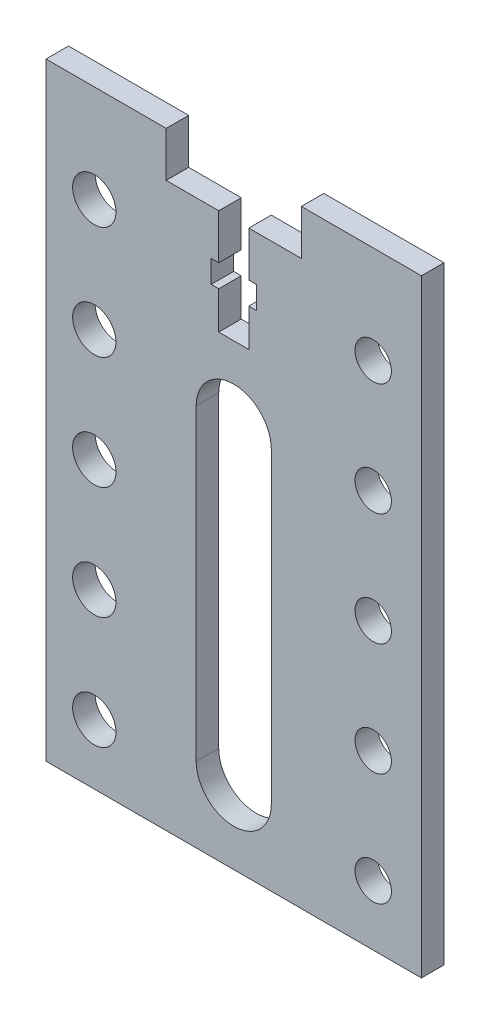
ISO-10303-21;
HEADER;
FILE_DESCRIPTION(('STEP AP214'),'2;1');
FILE_NAME('part.step','',(''),(''),'','','');
FILE_SCHEMA(('AUTOMOTIVE_DESIGN { 1 0 10303 214 1 1 1 1 }'));
ENDSEC;
DATA;
#1=APPLICATION_CONTEXT('core data for automotive mechanical design processes');
#2=APPLICATION_PROTOCOL_DEFINITION('international standard','automotive_design',2000,#1);
#3=PRODUCT_CONTEXT('',#1,'mechanical');
#4=PRODUCT('Part','Part','',(#3));
#5=PRODUCT_RELATED_PRODUCT_CATEGORY('part','',(#4));
#6=PRODUCT_DEFINITION_FORMATION('','',#4);
#7=PRODUCT_DEFINITION_CONTEXT('part definition',#1,'design');
#8=PRODUCT_DEFINITION('design','',#6,#7);
#9=PRODUCT_DEFINITION_SHAPE('','',#8);
#10=(LENGTH_UNIT() NAMED_UNIT(*) SI_UNIT(.MILLI.,.METRE.));
#11=(NAMED_UNIT(*) PLANE_ANGLE_UNIT() SI_UNIT($,.RADIAN.));
#12=(NAMED_UNIT(*) SI_UNIT($,.STERADIAN.) SOLID_ANGLE_UNIT());
#13=UNCERTAINTY_MEASURE_WITH_UNIT(LENGTH_MEASURE(1.E-05),#10,'distance_accuracy_value','');
#14=(GEOMETRIC_REPRESENTATION_CONTEXT(3) GLOBAL_UNCERTAINTY_ASSIGNED_CONTEXT((#13)) GLOBAL_UNIT_ASSIGNED_CONTEXT((#10,
#11,#12)) REPRESENTATION_CONTEXT('',''));
#15=CARTESIAN_POINT('',(0.,0.,0.));
#16=DIRECTION('',(0.,0.,1.));
#17=DIRECTION('',(1.,0.,0.));
#18=AXIS2_PLACEMENT_3D('',#15,#16,#17);
#19=CARTESIAN_POINT('',(-25.166294243022,47.6765560165975,0.));
#20=DIRECTION('',(0.,-1.,0.));
#21=DIRECTION('',(0.,0.,-1.));
#22=AXIS2_PLACEMENT_3D('',#19,#20,#21);
#23=PLANE('',#22);
#24=DIRECTION('',(1.,0.,0.));
#25=VECTOR('',#24,1.);
#26=CARTESIAN_POINT('',(-25.166294243022,47.6765560165975,3.));
#27=LINE('',#26,#25);
#28=CARTESIAN_POINT('',(-25.166294243022,47.6765560165975,3.));
#29=VERTEX_POINT('',#28);
#30=CARTESIAN_POINT('',(-18.166294243022,47.6765560165975,3.));
#31=VERTEX_POINT('',#30);
#32=EDGE_CURVE('E340',#29,#31,#27,.T.);
#33=ORIENTED_EDGE('',*,*,#32,.T.);
#34=DIRECTION('',(0.,0.,1.));
#35=VECTOR('',#34,1.);
#36=CARTESIAN_POINT('',(-18.166294243022,47.6765560165975,0.));
#37=LINE('',#36,#35);
#38=CARTESIAN_POINT('',(-18.166294243022,47.6765560165975,0.));
#39=VERTEX_POINT('',#38);
#40=EDGE_CURVE('E300',#39,#31,#37,.T.);
#41=ORIENTED_EDGE('',*,*,#40,.F.);
#42=DIRECTION('',(1.,0.,0.));
#43=VECTOR('',#42,1.);
#44=CARTESIAN_POINT('',(-25.166294243022,47.6765560165975,0.));
#45=LINE('',#44,#43);
#46=CARTESIAN_POINT('',(-25.166294243022,47.6765560165975,0.));
#47=VERTEX_POINT('',#46);
#48=EDGE_CURVE('E330',#47,#39,#45,.T.);
#49=ORIENTED_EDGE('',*,*,#48,.F.);
#50=DIRECTION('',(0.,0.,1.));
#51=VECTOR('',#50,1.);
#52=CARTESIAN_POINT('',(-25.166294243022,47.6765560165975,0.));
#53=LINE('',#52,#51);
#54=EDGE_CURVE('E336',#47,#29,#53,.T.);
#55=ORIENTED_EDGE('',*,*,#54,.T.);
#56=EDGE_LOOP('',(#33,#41,#49,#55));
#57=FACE_BOUND('',#56,.T.);
#58=ADVANCED_FACE('F33',(#57),#23,.F.);
#59=CARTESIAN_POINT('',(-41.166294243022,53.6765560165975,3.));
#60=DIRECTION('',(0.,-1.,0.));
#61=DIRECTION('',(0.,0.,-1.));
#62=AXIS2_PLACEMENT_3D('',#59,#60,#61);
#63=PLANE('',#62);
#64=DIRECTION('',(-1.,0.,0.));
#65=VECTOR('',#64,1.);
#66=CARTESIAN_POINT('',(-41.166294243022,53.6765560165975,3.));
#67=LINE('',#66,#65);
#68=CARTESIAN_POINT('',(-25.166294243022,53.6765560165975,3.));
#69=VERTEX_POINT('',#68);
#70=CARTESIAN_POINT('',(-41.166294243022,53.6765560165975,3.));
#71=VERTEX_POINT('',#70);
#72=EDGE_CURVE('E362',#69,#71,#67,.T.);
#73=ORIENTED_EDGE('',*,*,#72,.F.);
#74=DIRECTION('',(0.,0.,1.));
#75=VECTOR('',#74,1.);
#76=CARTESIAN_POINT('',(-25.166294243022,53.6765560165975,0.));
#77=LINE('',#76,#75);
#78=CARTESIAN_POINT('',(-25.166294243022,53.6765560165975,0.));
#79=VERTEX_POINT('',#78);
#80=EDGE_CURVE('E344',#79,#69,#77,.T.);
#81=ORIENTED_EDGE('',*,*,#80,.F.);
#82=DIRECTION('',(-1.,0.,0.));
#83=VECTOR('',#82,1.);
#84=CARTESIAN_POINT('',(-41.166294243022,53.6765560165975,0.));
#85=LINE('',#84,#83);
#86=CARTESIAN_POINT('',(-41.166294243022,53.6765560165975,0.));
#87=VERTEX_POINT('',#86);
#88=EDGE_CURVE('E373',#79,#87,#85,.T.);
#89=ORIENTED_EDGE('',*,*,#88,.T.);
#90=DIRECTION('',(0.,0.,-1.));
#91=VECTOR('',#90,1.);
#92=CARTESIAN_POINT('',(-41.166294243022,53.6765560165975,3.));
#93=LINE('',#92,#91);
#94=EDGE_CURVE('E366',#71,#87,#93,.T.);
#95=ORIENTED_EDGE('',*,*,#94,.F.);
#96=EDGE_LOOP('',(#73,#81,#89,#95));
#97=FACE_BOUND('',#96,.T.);
#98=ADVANCED_FACE('F408',(#97),#63,.F.);
#99=CARTESIAN_POINT('',(-41.166294243022,53.6765560165975,3.));
#100=DIRECTION('',(1.,0.,0.));
#101=DIRECTION('',(0.,0.,-1.));
#102=AXIS2_PLACEMENT_3D('',#99,#100,#101);
#103=PLANE('',#102);
#104=DIRECTION('',(0.,-1.,0.));
#105=VECTOR('',#104,1.);
#106=CARTESIAN_POINT('',(-41.166294243022,53.6765560165975,0.));
#107=LINE('',#106,#105);
#108=CARTESIAN_POINT('',(-41.166294243022,-27.3234439834025,0.));
#109=VERTEX_POINT('',#108);
#110=EDGE_CURVE('E346',#87,#109,#107,.T.);
#111=ORIENTED_EDGE('',*,*,#110,.T.);
#112=DIRECTION('',(0.,0.,-1.));
#113=VECTOR('',#112,1.);
#114=CARTESIAN_POINT('',(-41.166294243022,-27.3234439834025,3.));
#115=LINE('',#114,#113);
#116=CARTESIAN_POINT('',(-41.166294243022,-27.3234439834025,3.));
#117=VERTEX_POINT('',#116);
#118=EDGE_CURVE('E11',#117,#109,#115,.T.);
#119=ORIENTED_EDGE('',*,*,#118,.F.);
#120=DIRECTION('',(0.,-1.,0.));
#121=VECTOR('',#120,1.);
#122=CARTESIAN_POINT('',(-41.166294243022,53.6765560165975,3.));
#123=LINE('',#122,#121);
#124=EDGE_CURVE('E354',#71,#117,#123,.T.);
#125=ORIENTED_EDGE('',*,*,#124,.F.);
#126=ORIENTED_EDGE('',*,*,#94,.T.);
#127=EDGE_LOOP('',(#111,#119,#125,#126));
#128=FACE_BOUND('',#127,.T.);
#129=ADVANCED_FACE('F35',(#128),#103,.F.);
#130=CARTESIAN_POINT('',(-41.166294243022,-27.3234439834025,3.));
#131=DIRECTION('',(0.,1.,0.));
#132=DIRECTION('',(0.,0.,1.));
#133=AXIS2_PLACEMENT_3D('',#130,#131,#132);
#134=PLANE('',#133);
#135=DIRECTION('',(1.,0.,0.));
#136=VECTOR('',#135,1.);
#137=CARTESIAN_POINT('',(-41.166294243022,-27.3234439834025,0.));
#138=LINE('',#137,#136);
#139=CARTESIAN_POINT('',(8.83370575697797,-27.3234439834025,0.));
#140=VERTEX_POINT('',#139);
#141=EDGE_CURVE('E369',#109,#140,#138,.T.);
#142=ORIENTED_EDGE('',*,*,#141,.T.);
#143=DIRECTION('',(0.,0.,-1.));
#144=VECTOR('',#143,1.);
#145=CARTESIAN_POINT('',(8.83370575697797,-27.3234439834025,3.));
#146=LINE('',#145,#144);
#147=CARTESIAN_POINT('',(8.83370575697797,-27.3234439834025,3.));
#148=VERTEX_POINT('',#147);
#149=EDGE_CURVE('E41',#148,#140,#146,.T.);
#150=ORIENTED_EDGE('',*,*,#149,.F.);
#151=DIRECTION('',(1.,0.,0.));
#152=VECTOR('',#151,1.);
#153=CARTESIAN_POINT('',(-41.166294243022,-27.3234439834025,3.));
#154=LINE('',#153,#152);
#155=EDGE_CURVE('E357',#117,#148,#154,.T.);
#156=ORIENTED_EDGE('',*,*,#155,.F.);
#157=ORIENTED_EDGE('',*,*,#118,.T.);
#158=EDGE_LOOP('',(#142,#150,#156,#157));
#159=FACE_BOUND('',#158,.T.);
#160=ADVANCED_FACE('F401',(#159),#134,.F.);
#161=CARTESIAN_POINT('',(8.83370575697796,53.6765560165975,3.));
#162=DIRECTION('',(-1.,0.,0.));
#163=DIRECTION('',(0.,-1.,0.));
#164=AXIS2_PLACEMENT_3D('',#161,#162,#163);
#165=PLANE('',#164);
#166=DIRECTION('',(0.,1.,0.));
#167=VECTOR('',#166,1.);
#168=CARTESIAN_POINT('',(8.83370575697796,53.6765560165975,0.));
#169=LINE('',#168,#167);
#170=CARTESIAN_POINT('',(8.83370575697796,53.6765560165975,0.));
#171=VERTEX_POINT('',#170);
#172=EDGE_CURVE('E371',#140,#171,#169,.T.);
#173=ORIENTED_EDGE('',*,*,#172,.T.);
#174=DIRECTION('',(0.,0.,-1.));
#175=VECTOR('',#174,1.);
#176=CARTESIAN_POINT('',(8.83370575697796,53.6765560165975,3.));
#177=LINE('',#176,#175);
#178=CARTESIAN_POINT('',(8.83370575697796,53.6765560165975,3.));
#179=VERTEX_POINT('',#178);
#180=EDGE_CURVE('E378',#179,#171,#177,.T.);
#181=ORIENTED_EDGE('',*,*,#180,.F.);
#182=DIRECTION('',(0.,1.,0.));
#183=VECTOR('',#182,1.);
#184=CARTESIAN_POINT('',(8.83370575697796,53.6765560165975,3.));
#185=LINE('',#184,#183);
#186=EDGE_CURVE('E360',#148,#179,#185,.T.);
#187=ORIENTED_EDGE('',*,*,#186,.F.);
#188=ORIENTED_EDGE('',*,*,#149,.T.);
#189=EDGE_LOOP('',(#173,#181,#187,#188));
#190=FACE_BOUND('',#189,.T.);
#191=ADVANCED_FACE('F385',(#190),#165,.F.);
#192=CARTESIAN_POINT('',(-7.16629424302204,53.6765560165975,0.));
#193=VERTEX_POINT('',#192);
#194=EDGE_CURVE('E358',#171,#193,#85,.T.);
#195=ORIENTED_EDGE('',*,*,#194,.T.);
#196=DIRECTION('',(0.,0.,1.));
#197=VECTOR('',#196,1.);
#198=CARTESIAN_POINT('',(-7.16629424302204,53.6765560165975,0.));
#199=LINE('',#198,#197);
#200=CARTESIAN_POINT('',(-7.16629424302204,53.6765560165975,3.));
#201=VERTEX_POINT('',#200);
#202=EDGE_CURVE('E347',#193,#201,#199,.T.);
#203=ORIENTED_EDGE('',*,*,#202,.T.);
#204=EDGE_CURVE('E363',#179,#201,#67,.T.);
#205=ORIENTED_EDGE('',*,*,#204,.F.);
#206=ORIENTED_EDGE('',*,*,#180,.T.);
#207=EDGE_LOOP('',(#195,#203,#205,#206));
#208=FACE_BOUND('',#207,.T.);
#209=ADVANCED_FACE('F392',(#208),#63,.F.);
#210=CARTESIAN_POINT('',(0.,0.,3.));
#211=DIRECTION('',(0.,0.,1.));
#212=DIRECTION('',(1.,0.,0.));
#213=AXIS2_PLACEMENT_3D('',#210,#211,#212);
#214=PLANE('',#213);
#215=CARTESIAN_POINT('',(2.40870575697796,40.6765560165975,3.));
#216=DIRECTION('',(0.,0.,1.));
#217=DIRECTION('',(1.,0.,0.));
#218=AXIS2_PLACEMENT_3D('',#215,#216,#217);
#219=CIRCLE('',#218,2.42322983462693);
#220=CARTESIAN_POINT('',(4.83193559160489,40.6765560165975,3.));
#221=VERTEX_POINT('',#220);
#222=EDGE_CURVE('E770',#221,#221,#219,.T.);
#223=ORIENTED_EDGE('',*,*,#222,.F.);
#224=EDGE_LOOP('',(#223));
#225=FACE_BOUND('',#224,.T.);
#226=CARTESIAN_POINT('',(-34.741294243022,40.6765560165975,3.));
#227=DIRECTION('',(0.,0.,1.));
#228=DIRECTION('',(1.,0.,0.));
#229=AXIS2_PLACEMENT_3D('',#226,#227,#228);
#230=CIRCLE('',#229,2.88561072581813);
#231=CARTESIAN_POINT('',(-31.8556835172039,40.6765560165975,3.));
#232=VERTEX_POINT('',#231);
#233=EDGE_CURVE('E772',#232,#232,#230,.T.);
#234=ORIENTED_EDGE('',*,*,#233,.F.);
#235=EDGE_LOOP('',(#234));
#236=FACE_BOUND('',#235,.T.);
#237=CARTESIAN_POINT('',(2.40870575697796,25.6765560165975,3.));
#238=DIRECTION('',(0.,0.,1.));
#239=DIRECTION('',(1.,0.,0.));
#240=AXIS2_PLACEMENT_3D('',#237,#238,#239);
#241=CIRCLE('',#240,2.42322983462693);
#242=CARTESIAN_POINT('',(4.8319355916049,25.6765560165975,3.));
#243=VERTEX_POINT('',#242);
#244=EDGE_CURVE('E778',#243,#243,#241,.T.);
#245=ORIENTED_EDGE('',*,*,#244,.F.);
#246=EDGE_LOOP('',(#245));
#247=FACE_BOUND('',#246,.T.);
#248=CARTESIAN_POINT('',(-34.741294243022,25.6765560165975,3.));
#249=DIRECTION('',(0.,0.,1.));
#250=DIRECTION('',(1.,0.,0.));
#251=AXIS2_PLACEMENT_3D('',#248,#249,#250);
#252=CIRCLE('',#251,2.88561072581813);
#253=CARTESIAN_POINT('',(-31.8556835172039,25.6765560165975,3.));
#254=VERTEX_POINT('',#253);
#255=EDGE_CURVE('E784',#254,#254,#252,.T.);
#256=ORIENTED_EDGE('',*,*,#255,.F.);
#257=EDGE_LOOP('',(#256));
#258=FACE_BOUND('',#257,.T.);
#259=CARTESIAN_POINT('',(2.40870575697796,10.6765560165975,3.));
#260=DIRECTION('',(0.,0.,1.));
#261=DIRECTION('',(1.,0.,0.));
#262=AXIS2_PLACEMENT_3D('',#259,#260,#261);
#263=CIRCLE('',#262,2.42322983462693);
#264=CARTESIAN_POINT('',(4.8319355916049,10.6765560165975,3.));
#265=VERTEX_POINT('',#264);
#266=EDGE_CURVE('E790',#265,#265,#263,.T.);
#267=ORIENTED_EDGE('',*,*,#266,.F.);
#268=EDGE_LOOP('',(#267));
#269=FACE_BOUND('',#268,.T.);
#270=CARTESIAN_POINT('',(-34.741294243022,10.6765560165975,3.));
#271=DIRECTION('',(0.,0.,1.));
#272=DIRECTION('',(1.,0.,0.));
#273=AXIS2_PLACEMENT_3D('',#270,#271,#272);
#274=CIRCLE('',#273,2.88561072581813);
#275=CARTESIAN_POINT('',(-31.8556835172039,10.6765560165975,3.));
#276=VERTEX_POINT('',#275);
#277=EDGE_CURVE('E796',#276,#276,#274,.T.);
#278=ORIENTED_EDGE('',*,*,#277,.F.);
#279=EDGE_LOOP('',(#278));
#280=FACE_BOUND('',#279,.T.);
#281=CARTESIAN_POINT('',(2.40870575697796,-4.3234439834025,3.));
#282=DIRECTION('',(0.,0.,1.));
#283=DIRECTION('',(1.,0.,0.));
#284=AXIS2_PLACEMENT_3D('',#281,#282,#283);
#285=CIRCLE('',#284,2.42322983462693);
#286=CARTESIAN_POINT('',(4.8319355916049,-4.3234439834025,3.));
#287=VERTEX_POINT('',#286);
#288=EDGE_CURVE('E802',#287,#287,#285,.T.);
#289=ORIENTED_EDGE('',*,*,#288,.F.);
#290=EDGE_LOOP('',(#289));
#291=FACE_BOUND('',#290,.T.);
#292=CARTESIAN_POINT('',(-34.741294243022,-4.3234439834025,3.));
#293=DIRECTION('',(0.,0.,1.));
#294=DIRECTION('',(1.,0.,0.));
#295=AXIS2_PLACEMENT_3D('',#292,#293,#294);
#296=CIRCLE('',#295,2.88561072581813);
#297=CARTESIAN_POINT('',(-31.8556835172039,-4.3234439834025,3.));
#298=VERTEX_POINT('',#297);
#299=EDGE_CURVE('E808',#298,#298,#296,.T.);
#300=ORIENTED_EDGE('',*,*,#299,.F.);
#301=EDGE_LOOP('',(#300));
#302=FACE_BOUND('',#301,.T.);
#303=CARTESIAN_POINT('',(2.40870575697796,-19.3234439834025,3.));
#304=DIRECTION('',(0.,0.,1.));
#305=DIRECTION('',(1.,0.,0.));
#306=AXIS2_PLACEMENT_3D('',#303,#304,#305);
#307=CIRCLE('',#306,2.42322983462693);
#308=CARTESIAN_POINT('',(4.8319355916049,-19.3234439834025,3.));
#309=VERTEX_POINT('',#308);
#310=EDGE_CURVE('E814',#309,#309,#307,.T.);
#311=ORIENTED_EDGE('',*,*,#310,.F.);
#312=EDGE_LOOP('',(#311));
#313=FACE_BOUND('',#312,.T.);
#314=CARTESIAN_POINT('',(-34.741294243022,-19.3234439834025,3.));
#315=DIRECTION('',(0.,0.,1.));
#316=DIRECTION('',(1.,0.,0.));
#317=AXIS2_PLACEMENT_3D('',#314,#315,#316);
#318=CIRCLE('',#317,2.88561072581813);
#319=CARTESIAN_POINT('',(-31.8556835172039,-19.3234439834025,3.));
#320=VERTEX_POINT('',#319);
#321=EDGE_CURVE('E218',#320,#320,#318,.T.);
#322=ORIENTED_EDGE('',*,*,#321,.F.);
#323=EDGE_LOOP('',(#322));
#324=FACE_BOUND('',#323,.T.);
#325=CARTESIAN_POINT('',(-16.166294243022,23.6765560165975,3.));
#326=DIRECTION('',(0.,0.,1.));
#327=DIRECTION('',(1.,0.,0.));
#328=AXIS2_PLACEMENT_3D('',#325,#326,#327);
#329=CIRCLE('',#328,5.);
#330=CARTESIAN_POINT('',(-11.166294243022,23.6765560165975,3.));
#331=VERTEX_POINT('',#330);
#332=CARTESIAN_POINT('',(-21.166294243022,23.6765560165975,3.));
#333=VERTEX_POINT('',#332);
#334=EDGE_CURVE('E48',#331,#333,#329,.T.);
#335=ORIENTED_EDGE('',*,*,#334,.F.);
#336=DIRECTION('',(0.,1.,0.));
#337=VECTOR('',#336,1.);
#338=CARTESIAN_POINT('',(-11.166294243022,23.6765560165975,3.));
#339=LINE('',#338,#337);
#340=CARTESIAN_POINT('',(-11.166294243022,-17.3234439834025,3.));
#341=VERTEX_POINT('',#340);
#342=EDGE_CURVE('E212',#341,#331,#339,.T.);
#343=ORIENTED_EDGE('',*,*,#342,.F.);
#344=CARTESIAN_POINT('',(-16.166294243022,-17.3234439834025,3.));
#345=DIRECTION('',(0.,0.,1.));
#346=DIRECTION('',(1.,0.,0.));
#347=AXIS2_PLACEMENT_3D('',#344,#345,#346);
#348=CIRCLE('',#347,5.);
#349=CARTESIAN_POINT('',(-21.166294243022,-17.3234439834025,3.));
#350=VERTEX_POINT('',#349);
#351=EDGE_CURVE('E215',#350,#341,#348,.T.);
#352=ORIENTED_EDGE('',*,*,#351,.F.);
#353=DIRECTION('',(0.,-1.,0.));
#354=VECTOR('',#353,1.);
#355=CARTESIAN_POINT('',(-21.166294243022,23.6765560165975,3.));
#356=LINE('',#355,#354);
#357=EDGE_CURVE('E224',#333,#350,#356,.T.);
#358=ORIENTED_EDGE('',*,*,#357,.F.);
#359=EDGE_LOOP('',(#335,#343,#352,#358));
#360=FACE_BOUND('',#359,.T.);
#361=DIRECTION('',(0.,-1.,0.));
#362=VECTOR('',#361,1.);
#363=CARTESIAN_POINT('',(-18.166294243022,47.6765560165975,3.));
#364=LINE('',#363,#362);
#365=CARTESIAN_POINT('',(-18.166294243022,41.6765560165975,3.));
#366=VERTEX_POINT('',#365);
#367=EDGE_CURVE('E231',#31,#366,#364,.T.);
#368=ORIENTED_EDGE('',*,*,#367,.F.);
#369=ORIENTED_EDGE('',*,*,#32,.F.);
#370=DIRECTION('',(0.,-1.,0.));
#371=VECTOR('',#370,1.);
#372=CARTESIAN_POINT('',(-25.166294243022,53.6765560165975,3.));
#373=LINE('',#372,#371);
#374=EDGE_CURVE('E302',#69,#29,#373,.T.);
#375=ORIENTED_EDGE('',*,*,#374,.F.);
#376=ORIENTED_EDGE('',*,*,#72,.T.);
#377=ORIENTED_EDGE('',*,*,#124,.T.);
#378=ORIENTED_EDGE('',*,*,#155,.T.);
#379=ORIENTED_EDGE('',*,*,#186,.T.);
#380=ORIENTED_EDGE('',*,*,#204,.T.);
#381=DIRECTION('',(0.,1.,0.));
#382=VECTOR('',#381,1.);
#383=CARTESIAN_POINT('',(-7.16629424302204,53.6765560165975,3.));
#384=LINE('',#383,#382);
#385=CARTESIAN_POINT('',(-7.16629424302204,47.6765560165975,3.));
#386=VERTEX_POINT('',#385);
#387=EDGE_CURVE('E329',#386,#201,#384,.T.);
#388=ORIENTED_EDGE('',*,*,#387,.F.);
#389=CARTESIAN_POINT('',(-14.166294243022,47.6765560165975,3.));
#390=VERTEX_POINT('',#389);
#391=EDGE_CURVE('E339',#390,#386,#27,.T.);
#392=ORIENTED_EDGE('',*,*,#391,.F.);
#393=DIRECTION('',(0.,1.,0.));
#394=VECTOR('',#393,1.);
#395=CARTESIAN_POINT('',(-14.166294243022,47.6765560165975,3.));
#396=LINE('',#395,#394);
#397=CARTESIAN_POINT('',(-14.166294243022,41.6765560165975,3.));
#398=VERTEX_POINT('',#397);
#399=EDGE_CURVE('E239',#398,#390,#396,.T.);
#400=ORIENTED_EDGE('',*,*,#399,.F.);
#401=DIRECTION('',(-1.,0.,0.));
#402=VECTOR('',#401,1.);
#403=CARTESIAN_POINT('',(-13.166294243022,41.6765560165975,3.));
#404=LINE('',#403,#402);
#405=CARTESIAN_POINT('',(-13.166294243022,41.6765560165975,3.));
#406=VERTEX_POINT('',#405);
#407=EDGE_CURVE('E296',#406,#398,#404,.T.);
#408=ORIENTED_EDGE('',*,*,#407,.F.);
#409=DIRECTION('',(0.,1.,0.));
#410=VECTOR('',#409,1.);
#411=CARTESIAN_POINT('',(-13.166294243022,41.6765560165975,3.));
#412=LINE('',#411,#410);
#413=CARTESIAN_POINT('',(-13.166294243022,38.6765560165975,3.));
#414=VERTEX_POINT('',#413);
#415=EDGE_CURVE('E293',#414,#406,#412,.T.);
#416=ORIENTED_EDGE('',*,*,#415,.F.);
#417=DIRECTION('',(1.,0.,0.));
#418=VECTOR('',#417,1.);
#419=CARTESIAN_POINT('',(-13.166294243022,38.6765560165975,3.));
#420=LINE('',#419,#418);
#421=CARTESIAN_POINT('',(-14.166294243022,38.6765560165975,3.));
#422=VERTEX_POINT('',#421);
#423=EDGE_CURVE('E290',#422,#414,#420,.T.);
#424=ORIENTED_EDGE('',*,*,#423,.F.);
#425=DIRECTION('',(0.,1.,0.));
#426=VECTOR('',#425,1.);
#427=CARTESIAN_POINT('',(-14.166294243022,38.6765560165975,3.));
#428=LINE('',#427,#426);
#429=CARTESIAN_POINT('',(-14.166294243022,33.6765560165975,3.));
#430=VERTEX_POINT('',#429);
#431=EDGE_CURVE('E287',#430,#422,#428,.T.);
#432=ORIENTED_EDGE('',*,*,#431,.F.);
#433=DIRECTION('',(1.,0.,0.));
#434=VECTOR('',#433,1.);
#435=CARTESIAN_POINT('',(-18.166294243022,33.6765560165975,3.));
#436=LINE('',#435,#434);
#437=CARTESIAN_POINT('',(-18.166294243022,33.6765560165975,3.));
#438=VERTEX_POINT('',#437);
#439=EDGE_CURVE('E284',#438,#430,#436,.T.);
#440=ORIENTED_EDGE('',*,*,#439,.F.);
#441=DIRECTION('',(0.,-1.,0.));
#442=VECTOR('',#441,1.);
#443=CARTESIAN_POINT('',(-18.166294243022,38.6765560165975,3.));
#444=LINE('',#443,#442);
#445=CARTESIAN_POINT('',(-18.166294243022,38.6765560165975,3.));
#446=VERTEX_POINT('',#445);
#447=EDGE_CURVE('E281',#446,#438,#444,.T.);
#448=ORIENTED_EDGE('',*,*,#447,.F.);
#449=DIRECTION('',(1.,0.,0.));
#450=VECTOR('',#449,1.);
#451=CARTESIAN_POINT('',(-18.166294243022,38.6765560165975,3.));
#452=LINE('',#451,#450);
#453=CARTESIAN_POINT('',(-19.166294243022,38.6765560165975,3.));
#454=VERTEX_POINT('',#453);
#455=EDGE_CURVE('E278',#454,#446,#452,.T.);
#456=ORIENTED_EDGE('',*,*,#455,.F.);
#457=DIRECTION('',(0.,-1.,0.));
#458=VECTOR('',#457,1.);
#459=CARTESIAN_POINT('',(-19.166294243022,41.6765560165975,3.));
#460=LINE('',#459,#458);
#461=CARTESIAN_POINT('',(-19.166294243022,41.6765560165975,3.));
#462=VERTEX_POINT('',#461);
#463=EDGE_CURVE('E275',#462,#454,#460,.T.);
#464=ORIENTED_EDGE('',*,*,#463,.F.);
#465=DIRECTION('',(-1.,0.,0.));
#466=VECTOR('',#465,1.);
#467=CARTESIAN_POINT('',(-18.166294243022,41.6765560165975,3.));
#468=LINE('',#467,#466);
#469=EDGE_CURVE('E272',#366,#462,#468,.T.);
#470=ORIENTED_EDGE('',*,*,#469,.F.);
#471=EDGE_LOOP('',(#368,#369,#375,#376,#377,#378,#379,#380,#388,#392,#400,#408,#416,#424,#432,
#440,#448,#456,#464,#470));
#472=FACE_BOUND('',#471,.T.);
#473=ADVANCED_FACE('F397',(#225,#236,#247,#258,#269,#280,#291,#302,#313,#324,#360,#472),#214,.T.);
#474=CARTESIAN_POINT('',(0.,0.,0.));
#475=DIRECTION('',(0.,0.,1.));
#476=DIRECTION('',(1.,0.,0.));
#477=AXIS2_PLACEMENT_3D('',#474,#475,#476);
#478=PLANE('',#477);
#479=CARTESIAN_POINT('',(2.40870575697796,40.6765560165975,0.));
#480=DIRECTION('',(0.,0.,1.));
#481=DIRECTION('',(1.,0.,0.));
#482=AXIS2_PLACEMENT_3D('',#479,#480,#481);
#483=CIRCLE('',#482,2.42322983462693);
#484=CARTESIAN_POINT('',(4.83193559160489,40.6765560165975,0.));
#485=VERTEX_POINT('',#484);
#486=EDGE_CURVE('E767',#485,#485,#483,.T.);
#487=ORIENTED_EDGE('',*,*,#486,.T.);
#488=EDGE_LOOP('',(#487));
#489=FACE_BOUND('',#488,.T.);
#490=CARTESIAN_POINT('',(-34.741294243022,40.6765560165975,0.));
#491=DIRECTION('',(0.,0.,1.));
#492=DIRECTION('',(1.,0.,0.));
#493=AXIS2_PLACEMENT_3D('',#490,#491,#492);
#494=CIRCLE('',#493,2.88561072581813);
#495=CARTESIAN_POINT('',(-31.8556835172039,40.6765560165975,0.));
#496=VERTEX_POINT('',#495);
#497=EDGE_CURVE('E775',#496,#496,#494,.T.);
#498=ORIENTED_EDGE('',*,*,#497,.T.);
#499=EDGE_LOOP('',(#498));
#500=FACE_BOUND('',#499,.T.);
#501=CARTESIAN_POINT('',(2.40870575697796,25.6765560165975,0.));
#502=DIRECTION('',(0.,0.,1.));
#503=DIRECTION('',(1.,0.,0.));
#504=AXIS2_PLACEMENT_3D('',#501,#502,#503);
#505=CIRCLE('',#504,2.42322983462693);
#506=CARTESIAN_POINT('',(4.8319355916049,25.6765560165975,0.));
#507=VERTEX_POINT('',#506);
#508=EDGE_CURVE('E781',#507,#507,#505,.T.);
#509=ORIENTED_EDGE('',*,*,#508,.T.);
#510=EDGE_LOOP('',(#509));
#511=FACE_BOUND('',#510,.T.);
#512=CARTESIAN_POINT('',(-34.741294243022,25.6765560165975,0.));
#513=DIRECTION('',(0.,0.,1.));
#514=DIRECTION('',(1.,0.,0.));
#515=AXIS2_PLACEMENT_3D('',#512,#513,#514);
#516=CIRCLE('',#515,2.88561072581813);
#517=CARTESIAN_POINT('',(-31.8556835172039,25.6765560165975,0.));
#518=VERTEX_POINT('',#517);
#519=EDGE_CURVE('E787',#518,#518,#516,.T.);
#520=ORIENTED_EDGE('',*,*,#519,.T.);
#521=EDGE_LOOP('',(#520));
#522=FACE_BOUND('',#521,.T.);
#523=CARTESIAN_POINT('',(2.40870575697796,10.6765560165975,0.));
#524=DIRECTION('',(0.,0.,1.));
#525=DIRECTION('',(1.,0.,0.));
#526=AXIS2_PLACEMENT_3D('',#523,#524,#525);
#527=CIRCLE('',#526,2.42322983462693);
#528=CARTESIAN_POINT('',(4.8319355916049,10.6765560165975,0.));
#529=VERTEX_POINT('',#528);
#530=EDGE_CURVE('E793',#529,#529,#527,.T.);
#531=ORIENTED_EDGE('',*,*,#530,.T.);
#532=EDGE_LOOP('',(#531));
#533=FACE_BOUND('',#532,.T.);
#534=CARTESIAN_POINT('',(-34.741294243022,10.6765560165975,0.));
#535=DIRECTION('',(0.,0.,1.));
#536=DIRECTION('',(1.,0.,0.));
#537=AXIS2_PLACEMENT_3D('',#534,#535,#536);
#538=CIRCLE('',#537,2.88561072581813);
#539=CARTESIAN_POINT('',(-31.8556835172039,10.6765560165975,0.));
#540=VERTEX_POINT('',#539);
#541=EDGE_CURVE('E799',#540,#540,#538,.T.);
#542=ORIENTED_EDGE('',*,*,#541,.T.);
#543=EDGE_LOOP('',(#542));
#544=FACE_BOUND('',#543,.T.);
#545=CARTESIAN_POINT('',(2.40870575697796,-4.3234439834025,0.));
#546=DIRECTION('',(0.,0.,1.));
#547=DIRECTION('',(1.,0.,0.));
#548=AXIS2_PLACEMENT_3D('',#545,#546,#547);
#549=CIRCLE('',#548,2.42322983462693);
#550=CARTESIAN_POINT('',(4.8319355916049,-4.3234439834025,0.));
#551=VERTEX_POINT('',#550);
#552=EDGE_CURVE('E805',#551,#551,#549,.T.);
#553=ORIENTED_EDGE('',*,*,#552,.T.);
#554=EDGE_LOOP('',(#553));
#555=FACE_BOUND('',#554,.T.);
#556=CARTESIAN_POINT('',(-34.741294243022,-4.3234439834025,0.));
#557=DIRECTION('',(0.,0.,1.));
#558=DIRECTION('',(1.,0.,0.));
#559=AXIS2_PLACEMENT_3D('',#556,#557,#558);
#560=CIRCLE('',#559,2.88561072581813);
#561=CARTESIAN_POINT('',(-31.8556835172039,-4.3234439834025,0.));
#562=VERTEX_POINT('',#561);
#563=EDGE_CURVE('E811',#562,#562,#560,.T.);
#564=ORIENTED_EDGE('',*,*,#563,.T.);
#565=EDGE_LOOP('',(#564));
#566=FACE_BOUND('',#565,.T.);
#567=CARTESIAN_POINT('',(2.40870575697796,-19.3234439834025,0.));
#568=DIRECTION('',(0.,0.,1.));
#569=DIRECTION('',(1.,0.,0.));
#570=AXIS2_PLACEMENT_3D('',#567,#568,#569);
#571=CIRCLE('',#570,2.42322983462693);
#572=CARTESIAN_POINT('',(4.8319355916049,-19.3234439834025,0.));
#573=VERTEX_POINT('',#572);
#574=EDGE_CURVE('E817',#573,#573,#571,.T.);
#575=ORIENTED_EDGE('',*,*,#574,.T.);
#576=EDGE_LOOP('',(#575));
#577=FACE_BOUND('',#576,.T.);
#578=CARTESIAN_POINT('',(-34.741294243022,-19.3234439834025,0.));
#579=DIRECTION('',(0.,0.,1.));
#580=DIRECTION('',(1.,0.,0.));
#581=AXIS2_PLACEMENT_3D('',#578,#579,#580);
#582=CIRCLE('',#581,2.88561072581813);
#583=CARTESIAN_POINT('',(-31.8556835172039,-19.3234439834025,0.));
#584=VERTEX_POINT('',#583);
#585=EDGE_CURVE('E225',#584,#584,#582,.T.);
#586=ORIENTED_EDGE('',*,*,#585,.T.);
#587=EDGE_LOOP('',(#586));
#588=FACE_BOUND('',#587,.T.);
#589=DIRECTION('',(0.,1.,0.));
#590=VECTOR('',#589,1.);
#591=CARTESIAN_POINT('',(-11.166294243022,23.6765560165975,0.));
#592=LINE('',#591,#590);
#593=CARTESIAN_POINT('',(-11.166294243022,-17.3234439834025,0.));
#594=VERTEX_POINT('',#593);
#595=CARTESIAN_POINT('',(-11.166294243022,23.6765560165975,0.));
#596=VERTEX_POINT('',#595);
#597=EDGE_CURVE('E202',#594,#596,#592,.T.);
#598=ORIENTED_EDGE('',*,*,#597,.T.);
#599=CARTESIAN_POINT('',(-16.166294243022,23.6765560165975,0.));
#600=DIRECTION('',(0.,0.,1.));
#601=DIRECTION('',(1.,0.,0.));
#602=AXIS2_PLACEMENT_3D('',#599,#600,#601);
#603=CIRCLE('',#602,5.);
#604=CARTESIAN_POINT('',(-21.166294243022,23.6765560165975,0.));
#605=VERTEX_POINT('',#604);
#606=EDGE_CURVE('E196',#596,#605,#603,.T.);
#607=ORIENTED_EDGE('',*,*,#606,.T.);
#608=DIRECTION('',(0.,-1.,0.));
#609=VECTOR('',#608,1.);
#610=CARTESIAN_POINT('',(-21.166294243022,23.6765560165975,0.));
#611=LINE('',#610,#609);
#612=CARTESIAN_POINT('',(-21.166294243022,-17.3234439834025,0.));
#613=VERTEX_POINT('',#612);
#614=EDGE_CURVE('E205',#605,#613,#611,.T.);
#615=ORIENTED_EDGE('',*,*,#614,.T.);
#616=CARTESIAN_POINT('',(-16.166294243022,-17.3234439834025,0.));
#617=DIRECTION('',(0.,0.,1.));
#618=DIRECTION('',(1.,0.,0.));
#619=AXIS2_PLACEMENT_3D('',#616,#617,#618);
#620=CIRCLE('',#619,5.);
#621=EDGE_CURVE('E56',#613,#594,#620,.T.);
#622=ORIENTED_EDGE('',*,*,#621,.T.);
#623=EDGE_LOOP('',(#598,#607,#615,#622));
#624=FACE_BOUND('',#623,.T.);
#625=ORIENTED_EDGE('',*,*,#48,.T.);
#626=DIRECTION('',(0.,-1.,0.));
#627=VECTOR('',#626,1.);
#628=CARTESIAN_POINT('',(-18.166294243022,47.6765560165975,0.));
#629=LINE('',#628,#627);
#630=CARTESIAN_POINT('',(-18.166294243022,41.6765560165975,0.));
#631=VERTEX_POINT('',#630);
#632=EDGE_CURVE('E235',#39,#631,#629,.T.);
#633=ORIENTED_EDGE('',*,*,#632,.T.);
#634=DIRECTION('',(-1.,0.,0.));
#635=VECTOR('',#634,1.);
#636=CARTESIAN_POINT('',(-18.166294243022,41.6765560165975,0.));
#637=LINE('',#636,#635);
#638=CARTESIAN_POINT('',(-19.166294243022,41.6765560165975,0.));
#639=VERTEX_POINT('',#638);
#640=EDGE_CURVE('E238',#631,#639,#637,.T.);
#641=ORIENTED_EDGE('',*,*,#640,.T.);
#642=DIRECTION('',(0.,-1.,0.));
#643=VECTOR('',#642,1.);
#644=CARTESIAN_POINT('',(-19.166294243022,41.6765560165975,0.));
#645=LINE('',#644,#643);
#646=CARTESIAN_POINT('',(-19.166294243022,38.6765560165975,0.));
#647=VERTEX_POINT('',#646);
#648=EDGE_CURVE('E242',#639,#647,#645,.T.);
#649=ORIENTED_EDGE('',*,*,#648,.T.);
#650=DIRECTION('',(1.,0.,0.));
#651=VECTOR('',#650,1.);
#652=CARTESIAN_POINT('',(-18.166294243022,38.6765560165975,0.));
#653=LINE('',#652,#651);
#654=CARTESIAN_POINT('',(-18.166294243022,38.6765560165975,0.));
#655=VERTEX_POINT('',#654);
#656=EDGE_CURVE('E245',#647,#655,#653,.T.);
#657=ORIENTED_EDGE('',*,*,#656,.T.);
#658=DIRECTION('',(0.,-1.,0.));
#659=VECTOR('',#658,1.);
#660=CARTESIAN_POINT('',(-18.166294243022,38.6765560165975,0.));
#661=LINE('',#660,#659);
#662=CARTESIAN_POINT('',(-18.166294243022,33.6765560165975,0.));
#663=VERTEX_POINT('',#662);
#664=EDGE_CURVE('E248',#655,#663,#661,.T.);
#665=ORIENTED_EDGE('',*,*,#664,.T.);
#666=DIRECTION('',(1.,0.,0.));
#667=VECTOR('',#666,1.);
#668=CARTESIAN_POINT('',(-18.166294243022,33.6765560165975,0.));
#669=LINE('',#668,#667);
#670=CARTESIAN_POINT('',(-14.166294243022,33.6765560165975,0.));
#671=VERTEX_POINT('',#670);
#672=EDGE_CURVE('E251',#663,#671,#669,.T.);
#673=ORIENTED_EDGE('',*,*,#672,.T.);
#674=DIRECTION('',(0.,1.,0.));
#675=VECTOR('',#674,1.);
#676=CARTESIAN_POINT('',(-14.166294243022,38.6765560165975,0.));
#677=LINE('',#676,#675);
#678=CARTESIAN_POINT('',(-14.166294243022,38.6765560165975,0.));
#679=VERTEX_POINT('',#678);
#680=EDGE_CURVE('E254',#671,#679,#677,.T.);
#681=ORIENTED_EDGE('',*,*,#680,.T.);
#682=DIRECTION('',(1.,0.,0.));
#683=VECTOR('',#682,1.);
#684=CARTESIAN_POINT('',(-13.166294243022,38.6765560165975,0.));
#685=LINE('',#684,#683);
#686=CARTESIAN_POINT('',(-13.166294243022,38.6765560165975,0.));
#687=VERTEX_POINT('',#686);
#688=EDGE_CURVE('E257',#679,#687,#685,.T.);
#689=ORIENTED_EDGE('',*,*,#688,.T.);
#690=DIRECTION('',(0.,1.,0.));
#691=VECTOR('',#690,1.);
#692=CARTESIAN_POINT('',(-13.166294243022,41.6765560165975,0.));
#693=LINE('',#692,#691);
#694=CARTESIAN_POINT('',(-13.166294243022,41.6765560165975,0.));
#695=VERTEX_POINT('',#694);
#696=EDGE_CURVE('E260',#687,#695,#693,.T.);
#697=ORIENTED_EDGE('',*,*,#696,.T.);
#698=DIRECTION('',(-1.,0.,0.));
#699=VECTOR('',#698,1.);
#700=CARTESIAN_POINT('',(-13.166294243022,41.6765560165975,0.));
#701=LINE('',#700,#699);
#702=CARTESIAN_POINT('',(-14.166294243022,41.6765560165975,0.));
#703=VERTEX_POINT('',#702);
#704=EDGE_CURVE('E263',#695,#703,#701,.T.);
#705=ORIENTED_EDGE('',*,*,#704,.T.);
#706=DIRECTION('',(0.,1.,0.));
#707=VECTOR('',#706,1.);
#708=CARTESIAN_POINT('',(-14.166294243022,47.6765560165975,0.));
#709=LINE('',#708,#707);
#710=CARTESIAN_POINT('',(-14.166294243022,47.6765560165975,0.));
#711=VERTEX_POINT('',#710);
#712=EDGE_CURVE('E266',#703,#711,#709,.T.);
#713=ORIENTED_EDGE('',*,*,#712,.T.);
#714=CARTESIAN_POINT('',(-7.16629424302204,47.6765560165975,0.));
#715=VERTEX_POINT('',#714);
#716=EDGE_CURVE('E328',#711,#715,#45,.T.);
#717=ORIENTED_EDGE('',*,*,#716,.T.);
#718=DIRECTION('',(0.,1.,0.));
#719=VECTOR('',#718,1.);
#720=CARTESIAN_POINT('',(-7.16629424302204,53.6765560165975,0.));
#721=LINE('',#720,#719);
#722=EDGE_CURVE('E333',#715,#193,#721,.T.);
#723=ORIENTED_EDGE('',*,*,#722,.T.);
#724=ORIENTED_EDGE('',*,*,#194,.F.);
#725=ORIENTED_EDGE('',*,*,#172,.F.);
#726=ORIENTED_EDGE('',*,*,#141,.F.);
#727=ORIENTED_EDGE('',*,*,#110,.F.);
#728=ORIENTED_EDGE('',*,*,#88,.F.);
#729=DIRECTION('',(0.,-1.,0.));
#730=VECTOR('',#729,1.);
#731=CARTESIAN_POINT('',(-25.166294243022,53.6765560165975,0.));
#732=LINE('',#731,#730);
#733=EDGE_CURVE('E325',#79,#47,#732,.T.);
#734=ORIENTED_EDGE('',*,*,#733,.T.);
#735=EDGE_LOOP('',(#625,#633,#641,#649,#657,#665,#673,#681,#689,#697,#705,#713,#717,#723,#724,
#725,#726,#727,#728,#734));
#736=FACE_BOUND('',#735,.T.);
#737=ADVANCED_FACE('F209',(#489,#500,#511,#522,#533,#544,#555,#566,#577,#588,#624,#736),#478,.F.);
#738=CARTESIAN_POINT('',(-25.166294243022,53.6765560165975,0.));
#739=DIRECTION('',(-1.,0.,0.));
#740=DIRECTION('',(0.,0.,1.));
#741=AXIS2_PLACEMENT_3D('',#738,#739,#740);
#742=PLANE('',#741);
#743=ORIENTED_EDGE('',*,*,#374,.T.);
#744=ORIENTED_EDGE('',*,*,#54,.F.);
#745=ORIENTED_EDGE('',*,*,#733,.F.);
#746=ORIENTED_EDGE('',*,*,#80,.T.);
#747=EDGE_LOOP('',(#743,#744,#745,#746));
#748=FACE_BOUND('',#747,.T.);
#749=ADVANCED_FACE('F411',(#748),#742,.F.);
#750=CARTESIAN_POINT('',(-7.16629424302204,53.6765560165975,0.));
#751=DIRECTION('',(1.,0.,0.));
#752=DIRECTION('',(0.,0.,-1.));
#753=AXIS2_PLACEMENT_3D('',#750,#751,#752);
#754=PLANE('',#753);
#755=ORIENTED_EDGE('',*,*,#387,.T.);
#756=ORIENTED_EDGE('',*,*,#202,.F.);
#757=ORIENTED_EDGE('',*,*,#722,.F.);
#758=DIRECTION('',(0.,0.,1.));
#759=VECTOR('',#758,1.);
#760=CARTESIAN_POINT('',(-7.16629424302204,47.6765560165975,0.));
#761=LINE('',#760,#759);
#762=EDGE_CURVE('E350',#715,#386,#761,.T.);
#763=ORIENTED_EDGE('',*,*,#762,.T.);
#764=EDGE_LOOP('',(#755,#756,#757,#763));
#765=FACE_BOUND('',#764,.T.);
#766=ADVANCED_FACE('F463',(#765),#754,.F.);
#767=ORIENTED_EDGE('',*,*,#716,.F.);
#768=DIRECTION('',(0.,0.,1.));
#769=VECTOR('',#768,1.);
#770=CARTESIAN_POINT('',(-14.166294243022,47.6765560165975,0.));
#771=LINE('',#770,#769);
#772=EDGE_CURVE('E303',#711,#390,#771,.T.);
#773=ORIENTED_EDGE('',*,*,#772,.T.);
#774=ORIENTED_EDGE('',*,*,#391,.T.);
#775=ORIENTED_EDGE('',*,*,#762,.F.);
#776=EDGE_LOOP('',(#767,#773,#774,#775));
#777=FACE_BOUND('',#776,.T.);
#778=ADVANCED_FACE('F460',(#777),#23,.F.);
#779=CARTESIAN_POINT('',(-18.166294243022,47.6765560165975,0.));
#780=DIRECTION('',(-1.,0.,0.));
#781=DIRECTION('',(0.,0.,1.));
#782=AXIS2_PLACEMENT_3D('',#779,#780,#781);
#783=PLANE('',#782);
#784=ORIENTED_EDGE('',*,*,#367,.T.);
#785=DIRECTION('',(0.,0.,1.));
#786=VECTOR('',#785,1.);
#787=CARTESIAN_POINT('',(-18.166294243022,41.6765560165975,0.));
#788=LINE('',#787,#786);
#789=EDGE_CURVE('E269',#631,#366,#788,.T.);
#790=ORIENTED_EDGE('',*,*,#789,.F.);
#791=ORIENTED_EDGE('',*,*,#632,.F.);
#792=ORIENTED_EDGE('',*,*,#40,.T.);
#793=EDGE_LOOP('',(#784,#790,#791,#792));
#794=FACE_BOUND('',#793,.T.);
#795=ADVANCED_FACE('F419',(#794),#783,.F.);
#796=CARTESIAN_POINT('',(-14.166294243022,47.6765560165975,0.));
#797=DIRECTION('',(1.,0.,0.));
#798=DIRECTION('',(0.,0.,-1.));
#799=AXIS2_PLACEMENT_3D('',#796,#797,#798);
#800=PLANE('',#799);
#801=ORIENTED_EDGE('',*,*,#399,.T.);
#802=ORIENTED_EDGE('',*,*,#772,.F.);
#803=ORIENTED_EDGE('',*,*,#712,.F.);
#804=DIRECTION('',(0.,0.,1.));
#805=VECTOR('',#804,1.);
#806=CARTESIAN_POINT('',(-14.166294243022,41.6765560165975,0.));
#807=LINE('',#806,#805);
#808=EDGE_CURVE('E306',#703,#398,#807,.T.);
#809=ORIENTED_EDGE('',*,*,#808,.T.);
#810=EDGE_LOOP('',(#801,#802,#803,#809));
#811=FACE_BOUND('',#810,.T.);
#812=ADVANCED_FACE('F458',(#811),#800,.F.);
#813=CARTESIAN_POINT('',(-13.166294243022,41.6765560165975,0.));
#814=DIRECTION('',(0.,1.,0.));
#815=DIRECTION('',(0.,0.,1.));
#816=AXIS2_PLACEMENT_3D('',#813,#814,#815);
#817=PLANE('',#816);
#818=ORIENTED_EDGE('',*,*,#407,.T.);
#819=ORIENTED_EDGE('',*,*,#808,.F.);
#820=ORIENTED_EDGE('',*,*,#704,.F.);
#821=DIRECTION('',(0.,0.,1.));
#822=VECTOR('',#821,1.);
#823=CARTESIAN_POINT('',(-13.166294243022,41.6765560165975,0.));
#824=LINE('',#823,#822);
#825=EDGE_CURVE('E308',#695,#406,#824,.T.);
#826=ORIENTED_EDGE('',*,*,#825,.T.);
#827=EDGE_LOOP('',(#818,#819,#820,#826));
#828=FACE_BOUND('',#827,.T.);
#829=ADVANCED_FACE('F454',(#828),#817,.F.);
#830=CARTESIAN_POINT('',(-13.166294243022,41.6765560165975,0.));
#831=DIRECTION('',(1.,0.,0.));
#832=DIRECTION('',(0.,1.,0.));
#833=AXIS2_PLACEMENT_3D('',#830,#831,#832);
#834=PLANE('',#833);
#835=ORIENTED_EDGE('',*,*,#415,.T.);
#836=ORIENTED_EDGE('',*,*,#825,.F.);
#837=ORIENTED_EDGE('',*,*,#696,.F.);
#838=DIRECTION('',(0.,0.,1.));
#839=VECTOR('',#838,1.);
#840=CARTESIAN_POINT('',(-13.166294243022,38.6765560165975,0.));
#841=LINE('',#840,#839);
#842=EDGE_CURVE('E310',#687,#414,#841,.T.);
#843=ORIENTED_EDGE('',*,*,#842,.T.);
#844=EDGE_LOOP('',(#835,#836,#837,#843));
#845=FACE_BOUND('',#844,.T.);
#846=ADVANCED_FACE('F449',(#845),#834,.F.);
#847=CARTESIAN_POINT('',(-13.166294243022,38.6765560165975,0.));
#848=DIRECTION('',(0.,-1.,0.));
#849=DIRECTION('',(1.,0.,0.));
#850=AXIS2_PLACEMENT_3D('',#847,#848,#849);
#851=PLANE('',#850);
#852=ORIENTED_EDGE('',*,*,#423,.T.);
#853=ORIENTED_EDGE('',*,*,#842,.F.);
#854=ORIENTED_EDGE('',*,*,#688,.F.);
#855=DIRECTION('',(0.,0.,1.));
#856=VECTOR('',#855,1.);
#857=CARTESIAN_POINT('',(-14.166294243022,38.6765560165975,0.));
#858=LINE('',#857,#856);
#859=EDGE_CURVE('E312',#679,#422,#858,.T.);
#860=ORIENTED_EDGE('',*,*,#859,.T.);
#861=EDGE_LOOP('',(#852,#853,#854,#860));
#862=FACE_BOUND('',#861,.T.);
#863=ADVANCED_FACE('F445',(#862),#851,.F.);
#864=CARTESIAN_POINT('',(-14.166294243022,38.6765560165975,0.));
#865=DIRECTION('',(1.,0.,0.));
#866=DIRECTION('',(0.,0.,-1.));
#867=AXIS2_PLACEMENT_3D('',#864,#865,#866);
#868=PLANE('',#867);
#869=ORIENTED_EDGE('',*,*,#431,.T.);
#870=ORIENTED_EDGE('',*,*,#859,.F.);
#871=ORIENTED_EDGE('',*,*,#680,.F.);
#872=DIRECTION('',(0.,0.,1.));
#873=VECTOR('',#872,1.);
#874=CARTESIAN_POINT('',(-14.166294243022,33.6765560165975,0.));
#875=LINE('',#874,#873);
#876=EDGE_CURVE('E314',#671,#430,#875,.T.);
#877=ORIENTED_EDGE('',*,*,#876,.T.);
#878=EDGE_LOOP('',(#869,#870,#871,#877));
#879=FACE_BOUND('',#878,.T.);
#880=ADVANCED_FACE('F441',(#879),#868,.F.);
#881=CARTESIAN_POINT('',(-18.166294243022,33.6765560165975,0.));
#882=DIRECTION('',(0.,-1.,0.));
#883=DIRECTION('',(0.,0.,-1.));
#884=AXIS2_PLACEMENT_3D('',#881,#882,#883);
#885=PLANE('',#884);
#886=ORIENTED_EDGE('',*,*,#439,.T.);
#887=ORIENTED_EDGE('',*,*,#876,.F.);
#888=ORIENTED_EDGE('',*,*,#672,.F.);
#889=DIRECTION('',(0.,0.,1.));
#890=VECTOR('',#889,1.);
#891=CARTESIAN_POINT('',(-18.166294243022,33.6765560165975,0.));
#892=LINE('',#891,#890);
#893=EDGE_CURVE('E316',#663,#438,#892,.T.);
#894=ORIENTED_EDGE('',*,*,#893,.T.);
#895=EDGE_LOOP('',(#886,#887,#888,#894));
#896=FACE_BOUND('',#895,.T.);
#897=ADVANCED_FACE('F437',(#896),#885,.F.);
#898=CARTESIAN_POINT('',(-18.166294243022,38.6765560165975,0.));
#899=DIRECTION('',(-1.,0.,0.));
#900=DIRECTION('',(0.,0.,1.));
#901=AXIS2_PLACEMENT_3D('',#898,#899,#900);
#902=PLANE('',#901);
#903=ORIENTED_EDGE('',*,*,#447,.T.);
#904=ORIENTED_EDGE('',*,*,#893,.F.);
#905=ORIENTED_EDGE('',*,*,#664,.F.);
#906=DIRECTION('',(0.,0.,1.));
#907=VECTOR('',#906,1.);
#908=CARTESIAN_POINT('',(-18.166294243022,38.6765560165975,0.));
#909=LINE('',#908,#907);
#910=EDGE_CURVE('E318',#655,#446,#909,.T.);
#911=ORIENTED_EDGE('',*,*,#910,.T.);
#912=EDGE_LOOP('',(#903,#904,#905,#911));
#913=FACE_BOUND('',#912,.T.);
#914=ADVANCED_FACE('F433',(#913),#902,.F.);
#915=CARTESIAN_POINT('',(-18.166294243022,38.6765560165975,0.));
#916=DIRECTION('',(0.,-1.,0.));
#917=DIRECTION('',(1.,0.,0.));
#918=AXIS2_PLACEMENT_3D('',#915,#916,#917);
#919=PLANE('',#918);
#920=ORIENTED_EDGE('',*,*,#455,.T.);
#921=ORIENTED_EDGE('',*,*,#910,.F.);
#922=ORIENTED_EDGE('',*,*,#656,.F.);
#923=DIRECTION('',(0.,0.,1.));
#924=VECTOR('',#923,1.);
#925=CARTESIAN_POINT('',(-19.166294243022,38.6765560165975,0.));
#926=LINE('',#925,#924);
#927=EDGE_CURVE('E320',#647,#454,#926,.T.);
#928=ORIENTED_EDGE('',*,*,#927,.T.);
#929=EDGE_LOOP('',(#920,#921,#922,#928));
#930=FACE_BOUND('',#929,.T.);
#931=ADVANCED_FACE('F429',(#930),#919,.F.);
#932=CARTESIAN_POINT('',(-19.166294243022,41.6765560165975,0.));
#933=DIRECTION('',(-1.,0.,0.));
#934=DIRECTION('',(0.,-1.,0.));
#935=AXIS2_PLACEMENT_3D('',#932,#933,#934);
#936=PLANE('',#935);
#937=ORIENTED_EDGE('',*,*,#463,.T.);
#938=ORIENTED_EDGE('',*,*,#927,.F.);
#939=ORIENTED_EDGE('',*,*,#648,.F.);
#940=DIRECTION('',(0.,0.,1.));
#941=VECTOR('',#940,1.);
#942=CARTESIAN_POINT('',(-19.166294243022,41.6765560165975,0.));
#943=LINE('',#942,#941);
#944=EDGE_CURVE('E322',#639,#462,#943,.T.);
#945=ORIENTED_EDGE('',*,*,#944,.T.);
#946=EDGE_LOOP('',(#937,#938,#939,#945));
#947=FACE_BOUND('',#946,.T.);
#948=ADVANCED_FACE('F425',(#947),#936,.F.);
#949=CARTESIAN_POINT('',(-18.166294243022,41.6765560165975,0.));
#950=DIRECTION('',(0.,1.,0.));
#951=DIRECTION('',(0.,0.,1.));
#952=AXIS2_PLACEMENT_3D('',#949,#950,#951);
#953=PLANE('',#952);
#954=ORIENTED_EDGE('',*,*,#469,.T.);
#955=ORIENTED_EDGE('',*,*,#944,.F.);
#956=ORIENTED_EDGE('',*,*,#640,.F.);
#957=ORIENTED_EDGE('',*,*,#789,.T.);
#958=EDGE_LOOP('',(#954,#955,#956,#957));
#959=FACE_BOUND('',#958,.T.);
#960=ADVANCED_FACE('F421',(#959),#953,.F.);
#961=CARTESIAN_POINT('',(-16.166294243022,23.6765560165975,0.));
#962=DIRECTION('',(0.,0.,1.));
#963=DIRECTION('',(1.,0.,0.));
#964=AXIS2_PLACEMENT_3D('',#961,#962,#963);
#965=CYLINDRICAL_SURFACE('',#964,5.);
#966=ORIENTED_EDGE('',*,*,#334,.T.);
#967=DIRECTION('',(0.,0.,1.));
#968=VECTOR('',#967,1.);
#969=CARTESIAN_POINT('',(-21.166294243022,23.6765560165975,0.));
#970=LINE('',#969,#968);
#971=EDGE_CURVE('E192',#605,#333,#970,.T.);
#972=ORIENTED_EDGE('',*,*,#971,.F.);
#973=ORIENTED_EDGE('',*,*,#606,.F.);
#974=DIRECTION('',(0.,0.,1.));
#975=VECTOR('',#974,1.);
#976=CARTESIAN_POINT('',(-11.166294243022,23.6765560165975,0.));
#977=LINE('',#976,#975);
#978=EDGE_CURVE('E229',#596,#331,#977,.T.);
#979=ORIENTED_EDGE('',*,*,#978,.T.);
#980=EDGE_LOOP('',(#966,#972,#973,#979));
#981=FACE_BOUND('',#980,.T.);
#982=ADVANCED_FACE('F194',(#981),#965,.F.);
#983=CARTESIAN_POINT('',(-11.166294243022,23.6765560165975,0.));
#984=DIRECTION('',(1.,0.,0.));
#985=DIRECTION('',(0.,1.,0.));
#986=AXIS2_PLACEMENT_3D('',#983,#984,#985);
#987=PLANE('',#986);
#988=ORIENTED_EDGE('',*,*,#342,.T.);
#989=ORIENTED_EDGE('',*,*,#978,.F.);
#990=ORIENTED_EDGE('',*,*,#597,.F.);
#991=DIRECTION('',(0.,0.,1.));
#992=VECTOR('',#991,1.);
#993=CARTESIAN_POINT('',(-11.166294243022,-17.3234439834025,0.));
#994=LINE('',#993,#992);
#995=EDGE_CURVE('E232',#594,#341,#994,.T.);
#996=ORIENTED_EDGE('',*,*,#995,.T.);
#997=EDGE_LOOP('',(#988,#989,#990,#996));
#998=FACE_BOUND('',#997,.T.);
#999=ADVANCED_FACE('F624',(#998),#987,.F.);
#1000=CARTESIAN_POINT('',(-16.166294243022,-17.3234439834025,0.));
#1001=DIRECTION('',(0.,0.,1.));
#1002=DIRECTION('',(1.,0.,0.));
#1003=AXIS2_PLACEMENT_3D('',#1000,#1001,#1002);
#1004=CYLINDRICAL_SURFACE('',#1003,5.);
#1005=ORIENTED_EDGE('',*,*,#351,.T.);
#1006=ORIENTED_EDGE('',*,*,#995,.F.);
#1007=ORIENTED_EDGE('',*,*,#621,.F.);
#1008=DIRECTION('',(0.,0.,1.));
#1009=VECTOR('',#1008,1.);
#1010=CARTESIAN_POINT('',(-21.166294243022,-17.3234439834025,0.));
#1011=LINE('',#1010,#1009);
#1012=EDGE_CURVE('E201',#613,#350,#1011,.T.);
#1013=ORIENTED_EDGE('',*,*,#1012,.T.);
#1014=EDGE_LOOP('',(#1005,#1006,#1007,#1013));
#1015=FACE_BOUND('',#1014,.T.);
#1016=ADVANCED_FACE('F633',(#1015),#1004,.F.);
#1017=CARTESIAN_POINT('',(-21.166294243022,23.6765560165975,0.));
#1018=DIRECTION('',(-1.,0.,0.));
#1019=DIRECTION('',(0.,-1.,0.));
#1020=AXIS2_PLACEMENT_3D('',#1017,#1018,#1019);
#1021=PLANE('',#1020);
#1022=ORIENTED_EDGE('',*,*,#357,.T.);
#1023=ORIENTED_EDGE('',*,*,#1012,.F.);
#1024=ORIENTED_EDGE('',*,*,#614,.F.);
#1025=ORIENTED_EDGE('',*,*,#971,.T.);
#1026=EDGE_LOOP('',(#1022,#1023,#1024,#1025));
#1027=FACE_BOUND('',#1026,.T.);
#1028=ADVANCED_FACE('F206',(#1027),#1021,.F.);
#1029=CARTESIAN_POINT('',(-34.741294243022,-19.3234439834025,0.));
#1030=DIRECTION('',(0.,0.,1.));
#1031=DIRECTION('',(1.,0.,0.));
#1032=AXIS2_PLACEMENT_3D('',#1029,#1030,#1031);
#1033=CYLINDRICAL_SURFACE('',#1032,2.88561072581813);
#1034=ORIENTED_EDGE('',*,*,#585,.F.);
#1035=EDGE_LOOP('',(#1034));
#1036=FACE_BOUND('',#1035,.T.);
#1037=ORIENTED_EDGE('',*,*,#321,.T.);
#1038=EDGE_LOOP('',(#1037));
#1039=FACE_BOUND('',#1038,.T.);
#1040=ADVANCED_FACE('F651',(#1036,#1039),#1033,.F.);
#1041=CARTESIAN_POINT('',(2.40870575697796,-19.3234439834025,0.));
#1042=DIRECTION('',(0.,0.,1.));
#1043=DIRECTION('',(1.,0.,0.));
#1044=AXIS2_PLACEMENT_3D('',#1041,#1042,#1043);
#1045=CYLINDRICAL_SURFACE('',#1044,2.42322983462693);
#1046=ORIENTED_EDGE('',*,*,#574,.F.);
#1047=EDGE_LOOP('',(#1046));
#1048=FACE_BOUND('',#1047,.T.);
#1049=ORIENTED_EDGE('',*,*,#310,.T.);
#1050=EDGE_LOOP('',(#1049));
#1051=FACE_BOUND('',#1050,.T.);
#1052=ADVANCED_FACE('F670',(#1048,#1051),#1045,.F.);
#1053=CARTESIAN_POINT('',(-34.741294243022,-4.3234439834025,0.));
#1054=DIRECTION('',(0.,0.,1.));
#1055=DIRECTION('',(1.,0.,0.));
#1056=AXIS2_PLACEMENT_3D('',#1053,#1054,#1055);
#1057=CYLINDRICAL_SURFACE('',#1056,2.88561072581813);
#1058=ORIENTED_EDGE('',*,*,#563,.F.);
#1059=EDGE_LOOP('',(#1058));
#1060=FACE_BOUND('',#1059,.T.);
#1061=ORIENTED_EDGE('',*,*,#299,.T.);
#1062=EDGE_LOOP('',(#1061));
#1063=FACE_BOUND('',#1062,.T.);
#1064=ADVANCED_FACE('F680',(#1060,#1063),#1057,.F.);
#1065=CARTESIAN_POINT('',(2.40870575697796,-4.3234439834025,0.));
#1066=DIRECTION('',(0.,0.,1.));
#1067=DIRECTION('',(1.,0.,0.));
#1068=AXIS2_PLACEMENT_3D('',#1065,#1066,#1067);
#1069=CYLINDRICAL_SURFACE('',#1068,2.42322983462693);
#1070=ORIENTED_EDGE('',*,*,#552,.F.);
#1071=EDGE_LOOP('',(#1070));
#1072=FACE_BOUND('',#1071,.T.);
#1073=ORIENTED_EDGE('',*,*,#288,.T.);
#1074=EDGE_LOOP('',(#1073));
#1075=FACE_BOUND('',#1074,.T.);
#1076=ADVANCED_FACE('F690',(#1072,#1075),#1069,.F.);
#1077=CARTESIAN_POINT('',(-34.741294243022,10.6765560165975,0.));
#1078=DIRECTION('',(0.,0.,1.));
#1079=DIRECTION('',(1.,0.,0.));
#1080=AXIS2_PLACEMENT_3D('',#1077,#1078,#1079);
#1081=CYLINDRICAL_SURFACE('',#1080,2.88561072581813);
#1082=ORIENTED_EDGE('',*,*,#541,.F.);
#1083=EDGE_LOOP('',(#1082));
#1084=FACE_BOUND('',#1083,.T.);
#1085=ORIENTED_EDGE('',*,*,#277,.T.);
#1086=EDGE_LOOP('',(#1085));
#1087=FACE_BOUND('',#1086,.T.);
#1088=ADVANCED_FACE('F700',(#1084,#1087),#1081,.F.);
#1089=CARTESIAN_POINT('',(2.40870575697796,10.6765560165975,0.));
#1090=DIRECTION('',(0.,0.,1.));
#1091=DIRECTION('',(1.,0.,0.));
#1092=AXIS2_PLACEMENT_3D('',#1089,#1090,#1091);
#1093=CYLINDRICAL_SURFACE('',#1092,2.42322983462693);
#1094=ORIENTED_EDGE('',*,*,#530,.F.);
#1095=EDGE_LOOP('',(#1094));
#1096=FACE_BOUND('',#1095,.T.);
#1097=ORIENTED_EDGE('',*,*,#266,.T.);
#1098=EDGE_LOOP('',(#1097));
#1099=FACE_BOUND('',#1098,.T.);
#1100=ADVANCED_FACE('F710',(#1096,#1099),#1093,.F.);
#1101=CARTESIAN_POINT('',(-34.741294243022,25.6765560165975,0.));
#1102=DIRECTION('',(0.,0.,1.));
#1103=DIRECTION('',(1.,0.,0.));
#1104=AXIS2_PLACEMENT_3D('',#1101,#1102,#1103);
#1105=CYLINDRICAL_SURFACE('',#1104,2.88561072581813);
#1106=ORIENTED_EDGE('',*,*,#519,.F.);
#1107=EDGE_LOOP('',(#1106));
#1108=FACE_BOUND('',#1107,.T.);
#1109=ORIENTED_EDGE('',*,*,#255,.T.);
#1110=EDGE_LOOP('',(#1109));
#1111=FACE_BOUND('',#1110,.T.);
#1112=ADVANCED_FACE('F720',(#1108,#1111),#1105,.F.);
#1113=CARTESIAN_POINT('',(2.40870575697796,25.6765560165975,0.));
#1114=DIRECTION('',(0.,0.,1.));
#1115=DIRECTION('',(1.,0.,0.));
#1116=AXIS2_PLACEMENT_3D('',#1113,#1114,#1115);
#1117=CYLINDRICAL_SURFACE('',#1116,2.42322983462693);
#1118=ORIENTED_EDGE('',*,*,#508,.F.);
#1119=EDGE_LOOP('',(#1118));
#1120=FACE_BOUND('',#1119,.T.);
#1121=ORIENTED_EDGE('',*,*,#244,.T.);
#1122=EDGE_LOOP('',(#1121));
#1123=FACE_BOUND('',#1122,.T.);
#1124=ADVANCED_FACE('F730',(#1120,#1123),#1117,.F.);
#1125=CARTESIAN_POINT('',(-34.741294243022,40.6765560165975,0.));
#1126=DIRECTION('',(0.,0.,1.));
#1127=DIRECTION('',(1.,0.,0.));
#1128=AXIS2_PLACEMENT_3D('',#1125,#1126,#1127);
#1129=CYLINDRICAL_SURFACE('',#1128,2.88561072581813);
#1130=ORIENTED_EDGE('',*,*,#497,.F.);
#1131=EDGE_LOOP('',(#1130));
#1132=FACE_BOUND('',#1131,.T.);
#1133=ORIENTED_EDGE('',*,*,#233,.T.);
#1134=EDGE_LOOP('',(#1133));
#1135=FACE_BOUND('',#1134,.T.);
#1136=ADVANCED_FACE('F740',(#1132,#1135),#1129,.F.);
#1137=CARTESIAN_POINT('',(2.40870575697796,40.6765560165975,0.));
#1138=DIRECTION('',(0.,0.,1.));
#1139=DIRECTION('',(1.,0.,0.));
#1140=AXIS2_PLACEMENT_3D('',#1137,#1138,#1139);
#1141=CYLINDRICAL_SURFACE('',#1140,2.42322983462693);
#1142=ORIENTED_EDGE('',*,*,#486,.F.);
#1143=EDGE_LOOP('',(#1142));
#1144=FACE_BOUND('',#1143,.T.);
#1145=ORIENTED_EDGE('',*,*,#222,.T.);
#1146=EDGE_LOOP('',(#1145));
#1147=FACE_BOUND('',#1146,.T.);
#1148=ADVANCED_FACE('F750',(#1144,#1147),#1141,.F.);
#1149=CLOSED_SHELL('',(#58,#98,#129,#160,#191,#209,#473,#737,#749,#766,#778,#795,#812,#829,#846,
#863,#880,#897,#914,#931,#948,#960,#982,#999,#1016,#1028,#1040,#1052,#1064,#1076,#1088,#1100,
#1112,#1124,#1136,#1148));
#1150=MANIFOLD_SOLID_BREP('B2',#1149);
#1151=ADVANCED_BREP_SHAPE_REPRESENTATION('',(#18,#1150),#14);
#1152=SHAPE_DEFINITION_REPRESENTATION(#9,#1151);
ENDSEC;
END-ISO-10303-21;
